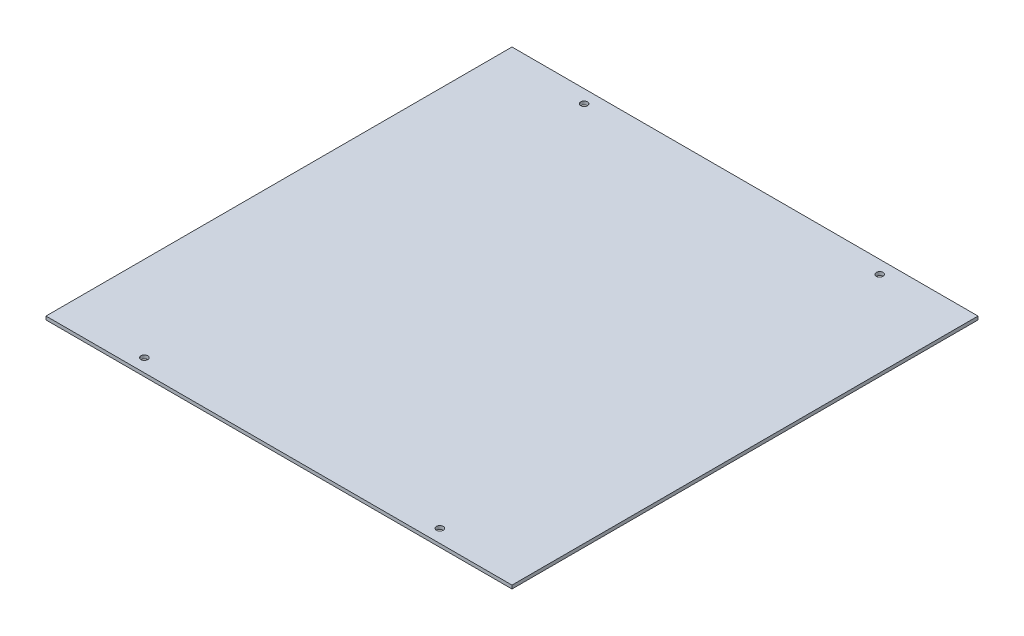
ISO-10303-21;
HEADER;
FILE_DESCRIPTION(('STEP AP214'),'2;1');
FILE_NAME('part.step','',(''),(''),'','','');
FILE_SCHEMA(('AUTOMOTIVE_DESIGN { 1 0 10303 214 1 1 1 1 }'));
ENDSEC;
DATA;
#1=APPLICATION_CONTEXT('core data for automotive mechanical design processes');
#2=APPLICATION_PROTOCOL_DEFINITION('international standard','automotive_design',2000,#1);
#3=PRODUCT_CONTEXT('',#1,'mechanical');
#4=PRODUCT('Part','Part','',(#3));
#5=PRODUCT_RELATED_PRODUCT_CATEGORY('part','',(#4));
#6=PRODUCT_DEFINITION_FORMATION('','',#4);
#7=PRODUCT_DEFINITION_CONTEXT('part definition',#1,'design');
#8=PRODUCT_DEFINITION('design','',#6,#7);
#9=PRODUCT_DEFINITION_SHAPE('','',#8);
#10=(LENGTH_UNIT() NAMED_UNIT(*) SI_UNIT(.MILLI.,.METRE.));
#11=(NAMED_UNIT(*) PLANE_ANGLE_UNIT() SI_UNIT($,.RADIAN.));
#12=(NAMED_UNIT(*) SI_UNIT($,.STERADIAN.) SOLID_ANGLE_UNIT());
#13=UNCERTAINTY_MEASURE_WITH_UNIT(LENGTH_MEASURE(1.E-05),#10,'distance_accuracy_value','');
#14=(GEOMETRIC_REPRESENTATION_CONTEXT(3) GLOBAL_UNCERTAINTY_ASSIGNED_CONTEXT((#13)) GLOBAL_UNIT_ASSIGNED_CONTEXT((#10,
#11,#12)) REPRESENTATION_CONTEXT('',''));
#15=CARTESIAN_POINT('',(0.,0.,0.));
#16=DIRECTION('',(0.,0.,1.));
#17=DIRECTION('',(1.,0.,0.));
#18=AXIS2_PLACEMENT_3D('',#15,#16,#17);
#19=CARTESIAN_POINT('',(0.,3.,0.));
#20=DIRECTION('',(0.,1.,0.));
#21=DIRECTION('',(0.,0.,1.));
#22=AXIS2_PLACEMENT_3D('',#19,#20,#21);
#23=PLANE('',#22);
#24=CARTESIAN_POINT('',(130.,3.,193.489267673648));
#25=DIRECTION('',(0.,1.,0.));
#26=DIRECTION('',(0.,0.,1.));
#27=AXIS2_PLACEMENT_3D('',#24,#25,#26);
#28=CIRCLE('',#27,2.99999999999999);
#29=CARTESIAN_POINT('',(130.,3.,196.489267673648));
#30=VERTEX_POINT('',#29);
#31=EDGE_CURVE('E142',#30,#30,#28,.T.);
#32=ORIENTED_EDGE('',*,*,#31,.F.);
#33=EDGE_LOOP('',(#32));
#34=FACE_BOUND('',#33,.T.);
#35=CARTESIAN_POINT('',(-130.,3.,-193.489267673648));
#36=DIRECTION('',(0.,1.,0.));
#37=DIRECTION('',(0.,0.,1.));
#38=AXIS2_PLACEMENT_3D('',#35,#36,#37);
#39=CIRCLE('',#38,2.99999999999999);
#40=CARTESIAN_POINT('',(-130.,3.,-190.489267673648));
#41=VERTEX_POINT('',#40);
#42=EDGE_CURVE('E112',#41,#41,#39,.T.);
#43=ORIENTED_EDGE('',*,*,#42,.F.);
#44=EDGE_LOOP('',(#43));
#45=FACE_BOUND('',#44,.T.);
#46=DIRECTION('',(0.,0.,-1.));
#47=VECTOR('',#46,1.);
#48=CARTESIAN_POINT('',(205.,3.,-205.));
#49=LINE('',#48,#47);
#50=CARTESIAN_POINT('',(205.,3.,205.));
#51=VERTEX_POINT('',#50);
#52=CARTESIAN_POINT('',(205.,3.,-205.));
#53=VERTEX_POINT('',#52);
#54=EDGE_CURVE('E92',#51,#53,#49,.T.);
#55=ORIENTED_EDGE('',*,*,#54,.T.);
#56=DIRECTION('',(-1.,0.,0.));
#57=VECTOR('',#56,1.);
#58=CARTESIAN_POINT('',(-205.,3.,-205.));
#59=LINE('',#58,#57);
#60=CARTESIAN_POINT('',(-205.,3.,-205.));
#61=VERTEX_POINT('',#60);
#62=EDGE_CURVE('E87',#53,#61,#59,.T.);
#63=ORIENTED_EDGE('',*,*,#62,.T.);
#64=DIRECTION('',(0.,0.,1.));
#65=VECTOR('',#64,1.);
#66=CARTESIAN_POINT('',(-205.,3.,-205.));
#67=LINE('',#66,#65);
#68=CARTESIAN_POINT('',(-205.,3.,205.));
#69=VERTEX_POINT('',#68);
#70=EDGE_CURVE('E90',#61,#69,#67,.T.);
#71=ORIENTED_EDGE('',*,*,#70,.T.);
#72=DIRECTION('',(1.,0.,0.));
#73=VECTOR('',#72,1.);
#74=CARTESIAN_POINT('',(-205.,3.,205.));
#75=LINE('',#74,#73);
#76=EDGE_CURVE('E57',#69,#51,#75,.T.);
#77=ORIENTED_EDGE('',*,*,#76,.T.);
#78=EDGE_LOOP('',(#55,#63,#71,#77));
#79=FACE_BOUND('',#78,.T.);
#80=CARTESIAN_POINT('',(130.,3.,-193.489267673648));
#81=DIRECTION('',(0.,1.,0.));
#82=DIRECTION('',(0.,0.,-1.));
#83=AXIS2_PLACEMENT_3D('',#80,#81,#82);
#84=CIRCLE('',#83,2.99999999999999);
#85=CARTESIAN_POINT('',(130.,3.,-196.489267673648));
#86=VERTEX_POINT('',#85);
#87=EDGE_CURVE('E134',#86,#86,#84,.T.);
#88=ORIENTED_EDGE('',*,*,#87,.F.);
#89=EDGE_LOOP('',(#88));
#90=FACE_BOUND('',#89,.T.);
#91=CARTESIAN_POINT('',(-130.,3.,193.489267673648));
#92=DIRECTION('',(0.,1.,0.));
#93=DIRECTION('',(0.,0.,-1.));
#94=AXIS2_PLACEMENT_3D('',#91,#92,#93);
#95=CIRCLE('',#94,2.99999999999999);
#96=CARTESIAN_POINT('',(-130.,3.,190.489267673648));
#97=VERTEX_POINT('',#96);
#98=EDGE_CURVE('E150',#97,#97,#95,.T.);
#99=ORIENTED_EDGE('',*,*,#98,.F.);
#100=EDGE_LOOP('',(#99));
#101=FACE_BOUND('',#100,.T.);
#102=ADVANCED_FACE('F39',(#34,#45,#79,#90,#101),#23,.T.);
#103=CARTESIAN_POINT('',(0.,0.,0.));
#104=DIRECTION('',(0.,1.,0.));
#105=DIRECTION('',(0.,0.,1.));
#106=AXIS2_PLACEMENT_3D('',#103,#104,#105);
#107=PLANE('',#106);
#108=DIRECTION('',(0.,0.,-1.));
#109=VECTOR('',#108,1.);
#110=CARTESIAN_POINT('',(205.,0.,-205.));
#111=LINE('',#110,#109);
#112=CARTESIAN_POINT('',(205.,0.,205.));
#113=VERTEX_POINT('',#112);
#114=CARTESIAN_POINT('',(205.,0.,-205.));
#115=VERTEX_POINT('',#114);
#116=EDGE_CURVE('E108',#113,#115,#111,.T.);
#117=ORIENTED_EDGE('',*,*,#116,.F.);
#118=DIRECTION('',(1.,0.,0.));
#119=VECTOR('',#118,1.);
#120=CARTESIAN_POINT('',(-205.,0.,205.));
#121=LINE('',#120,#119);
#122=CARTESIAN_POINT('',(-205.,0.,205.));
#123=VERTEX_POINT('',#122);
#124=EDGE_CURVE('E80',#123,#113,#121,.T.);
#125=ORIENTED_EDGE('',*,*,#124,.F.);
#126=DIRECTION('',(0.,0.,1.));
#127=VECTOR('',#126,1.);
#128=CARTESIAN_POINT('',(-205.,0.,-205.));
#129=LINE('',#128,#127);
#130=CARTESIAN_POINT('',(-205.,0.,-205.));
#131=VERTEX_POINT('',#130);
#132=EDGE_CURVE('E74',#131,#123,#129,.T.);
#133=ORIENTED_EDGE('',*,*,#132,.F.);
#134=DIRECTION('',(-1.,0.,0.));
#135=VECTOR('',#134,1.);
#136=CARTESIAN_POINT('',(-205.,0.,-205.));
#137=LINE('',#136,#135);
#138=EDGE_CURVE('E97',#115,#131,#137,.T.);
#139=ORIENTED_EDGE('',*,*,#138,.F.);
#140=EDGE_LOOP('',(#117,#125,#133,#139));
#141=FACE_BOUND('',#140,.T.);
#142=CARTESIAN_POINT('',(-130.,0.,-193.489267673648));
#143=DIRECTION('',(0.,1.,0.));
#144=DIRECTION('',(0.,0.,1.));
#145=AXIS2_PLACEMENT_3D('',#142,#143,#144);
#146=CIRCLE('',#145,2.99999999999999);
#147=CARTESIAN_POINT('',(-130.,0.,-190.489267673648));
#148=VERTEX_POINT('',#147);
#149=EDGE_CURVE('E130',#148,#148,#146,.T.);
#150=ORIENTED_EDGE('',*,*,#149,.T.);
#151=EDGE_LOOP('',(#150));
#152=FACE_BOUND('',#151,.T.);
#153=CARTESIAN_POINT('',(130.,0.,-193.489267673648));
#154=DIRECTION('',(0.,1.,0.));
#155=DIRECTION('',(0.,0.,-1.));
#156=AXIS2_PLACEMENT_3D('',#153,#154,#155);
#157=CIRCLE('',#156,2.99999999999999);
#158=CARTESIAN_POINT('',(130.,0.,-196.489267673648));
#159=VERTEX_POINT('',#158);
#160=EDGE_CURVE('E138',#159,#159,#157,.T.);
#161=ORIENTED_EDGE('',*,*,#160,.T.);
#162=EDGE_LOOP('',(#161));
#163=FACE_BOUND('',#162,.T.);
#164=CARTESIAN_POINT('',(130.,0.,193.489267673648));
#165=DIRECTION('',(0.,1.,0.));
#166=DIRECTION('',(0.,0.,1.));
#167=AXIS2_PLACEMENT_3D('',#164,#165,#166);
#168=CIRCLE('',#167,2.99999999999999);
#169=CARTESIAN_POINT('',(130.,0.,196.489267673648));
#170=VERTEX_POINT('',#169);
#171=EDGE_CURVE('E146',#170,#170,#168,.T.);
#172=ORIENTED_EDGE('',*,*,#171,.T.);
#173=EDGE_LOOP('',(#172));
#174=FACE_BOUND('',#173,.T.);
#175=CARTESIAN_POINT('',(-130.,0.,193.489267673648));
#176=DIRECTION('',(0.,1.,0.));
#177=DIRECTION('',(0.,0.,-1.));
#178=AXIS2_PLACEMENT_3D('',#175,#176,#177);
#179=CIRCLE('',#178,2.99999999999999);
#180=CARTESIAN_POINT('',(-130.,0.,190.489267673648));
#181=VERTEX_POINT('',#180);
#182=EDGE_CURVE('E154',#181,#181,#179,.T.);
#183=ORIENTED_EDGE('',*,*,#182,.T.);
#184=EDGE_LOOP('',(#183));
#185=FACE_BOUND('',#184,.T.);
#186=ADVANCED_FACE('F125',(#141,#152,#163,#174,#185),#107,.F.);
#187=CARTESIAN_POINT('',(205.,3.,-205.));
#188=DIRECTION('',(-1.,0.,0.));
#189=DIRECTION('',(0.,0.,1.));
#190=AXIS2_PLACEMENT_3D('',#187,#188,#189);
#191=PLANE('',#190);
#192=ORIENTED_EDGE('',*,*,#116,.T.);
#193=DIRECTION('',(0.,-1.,0.));
#194=VECTOR('',#193,1.);
#195=CARTESIAN_POINT('',(205.,3.,-205.));
#196=LINE('',#195,#194);
#197=EDGE_CURVE('E11',#53,#115,#196,.T.);
#198=ORIENTED_EDGE('',*,*,#197,.F.);
#199=ORIENTED_EDGE('',*,*,#54,.F.);
#200=DIRECTION('',(0.,-1.,0.));
#201=VECTOR('',#200,1.);
#202=CARTESIAN_POINT('',(205.,3.,205.));
#203=LINE('',#202,#201);
#204=EDGE_CURVE('E104',#51,#113,#203,.T.);
#205=ORIENTED_EDGE('',*,*,#204,.T.);
#206=EDGE_LOOP('',(#192,#198,#199,#205));
#207=FACE_BOUND('',#206,.T.);
#208=ADVANCED_FACE('F41',(#207),#191,.F.);
#209=CARTESIAN_POINT('',(-205.,3.,-205.));
#210=DIRECTION('',(0.,0.,1.));
#211=DIRECTION('',(1.,0.,0.));
#212=AXIS2_PLACEMENT_3D('',#209,#210,#211);
#213=PLANE('',#212);
#214=ORIENTED_EDGE('',*,*,#138,.T.);
#215=DIRECTION('',(0.,-1.,0.));
#216=VECTOR('',#215,1.);
#217=CARTESIAN_POINT('',(-205.,3.,-205.));
#218=LINE('',#217,#216);
#219=EDGE_CURVE('E49',#61,#131,#218,.T.);
#220=ORIENTED_EDGE('',*,*,#219,.F.);
#221=ORIENTED_EDGE('',*,*,#62,.F.);
#222=ORIENTED_EDGE('',*,*,#197,.T.);
#223=EDGE_LOOP('',(#214,#220,#221,#222));
#224=FACE_BOUND('',#223,.T.);
#225=ADVANCED_FACE('F96',(#224),#213,.F.);
#226=CARTESIAN_POINT('',(-205.,3.,-205.));
#227=DIRECTION('',(1.,0.,0.));
#228=DIRECTION('',(0.,0.,-1.));
#229=AXIS2_PLACEMENT_3D('',#226,#227,#228);
#230=PLANE('',#229);
#231=ORIENTED_EDGE('',*,*,#132,.T.);
#232=DIRECTION('',(0.,-1.,0.));
#233=VECTOR('',#232,1.);
#234=CARTESIAN_POINT('',(-205.,3.,205.));
#235=LINE('',#234,#233);
#236=EDGE_CURVE('E99',#69,#123,#235,.T.);
#237=ORIENTED_EDGE('',*,*,#236,.F.);
#238=ORIENTED_EDGE('',*,*,#70,.F.);
#239=ORIENTED_EDGE('',*,*,#219,.T.);
#240=EDGE_LOOP('',(#231,#237,#238,#239));
#241=FACE_BOUND('',#240,.T.);
#242=ADVANCED_FACE('F100',(#241),#230,.F.);
#243=CARTESIAN_POINT('',(-205.,3.,205.));
#244=DIRECTION('',(0.,0.,-1.));
#245=DIRECTION('',(-1.,0.,0.));
#246=AXIS2_PLACEMENT_3D('',#243,#244,#245);
#247=PLANE('',#246);
#248=ORIENTED_EDGE('',*,*,#124,.T.);
#249=ORIENTED_EDGE('',*,*,#204,.F.);
#250=ORIENTED_EDGE('',*,*,#76,.F.);
#251=ORIENTED_EDGE('',*,*,#236,.T.);
#252=EDGE_LOOP('',(#248,#249,#250,#251));
#253=FACE_BOUND('',#252,.T.);
#254=ADVANCED_FACE('F122',(#253),#247,.F.);
#255=CARTESIAN_POINT('',(-130.,3.,-193.489267673648));
#256=DIRECTION('',(0.,-1.,0.));
#257=DIRECTION('',(0.,0.,-1.));
#258=AXIS2_PLACEMENT_3D('',#255,#256,#257);
#259=CYLINDRICAL_SURFACE('',#258,2.99999999999999);
#260=ORIENTED_EDGE('',*,*,#42,.T.);
#261=EDGE_LOOP('',(#260));
#262=FACE_BOUND('',#261,.T.);
#263=ORIENTED_EDGE('',*,*,#149,.F.);
#264=EDGE_LOOP('',(#263));
#265=FACE_BOUND('',#264,.T.);
#266=ADVANCED_FACE('F175',(#262,#265),#259,.F.);
#267=CARTESIAN_POINT('',(130.,3.,-193.489267673648));
#268=DIRECTION('',(0.,-1.,0.));
#269=DIRECTION('',(0.,0.,-1.));
#270=AXIS2_PLACEMENT_3D('',#267,#268,#269);
#271=CYLINDRICAL_SURFACE('',#270,2.99999999999999);
#272=ORIENTED_EDGE('',*,*,#87,.T.);
#273=EDGE_LOOP('',(#272));
#274=FACE_BOUND('',#273,.T.);
#275=ORIENTED_EDGE('',*,*,#160,.F.);
#276=EDGE_LOOP('',(#275));
#277=FACE_BOUND('',#276,.T.);
#278=ADVANCED_FACE('F221',(#274,#277),#271,.F.);
#279=CARTESIAN_POINT('',(130.,3.,193.489267673648));
#280=DIRECTION('',(0.,-1.,0.));
#281=DIRECTION('',(0.,0.,-1.));
#282=AXIS2_PLACEMENT_3D('',#279,#280,#281);
#283=CYLINDRICAL_SURFACE('',#282,2.99999999999999);
#284=ORIENTED_EDGE('',*,*,#31,.T.);
#285=EDGE_LOOP('',(#284));
#286=FACE_BOUND('',#285,.T.);
#287=ORIENTED_EDGE('',*,*,#171,.F.);
#288=EDGE_LOOP('',(#287));
#289=FACE_BOUND('',#288,.T.);
#290=ADVANCED_FACE('F229',(#286,#289),#283,.F.);
#291=CARTESIAN_POINT('',(-130.,3.,193.489267673648));
#292=DIRECTION('',(0.,-1.,0.));
#293=DIRECTION('',(0.,0.,-1.));
#294=AXIS2_PLACEMENT_3D('',#291,#292,#293);
#295=CYLINDRICAL_SURFACE('',#294,2.99999999999999);
#296=ORIENTED_EDGE('',*,*,#98,.T.);
#297=EDGE_LOOP('',(#296));
#298=FACE_BOUND('',#297,.T.);
#299=ORIENTED_EDGE('',*,*,#182,.F.);
#300=EDGE_LOOP('',(#299));
#301=FACE_BOUND('',#300,.T.);
#302=ADVANCED_FACE('F162',(#298,#301),#295,.F.);
#303=CLOSED_SHELL('',(#102,#186,#208,#225,#242,#254,#266,#278,#290,#302));
#304=MANIFOLD_SOLID_BREP('B2',#303);
#305=ADVANCED_BREP_SHAPE_REPRESENTATION('',(#18,#304),#14);
#306=SHAPE_DEFINITION_REPRESENTATION(#9,#305);
ENDSEC;
END-ISO-10303-21;
